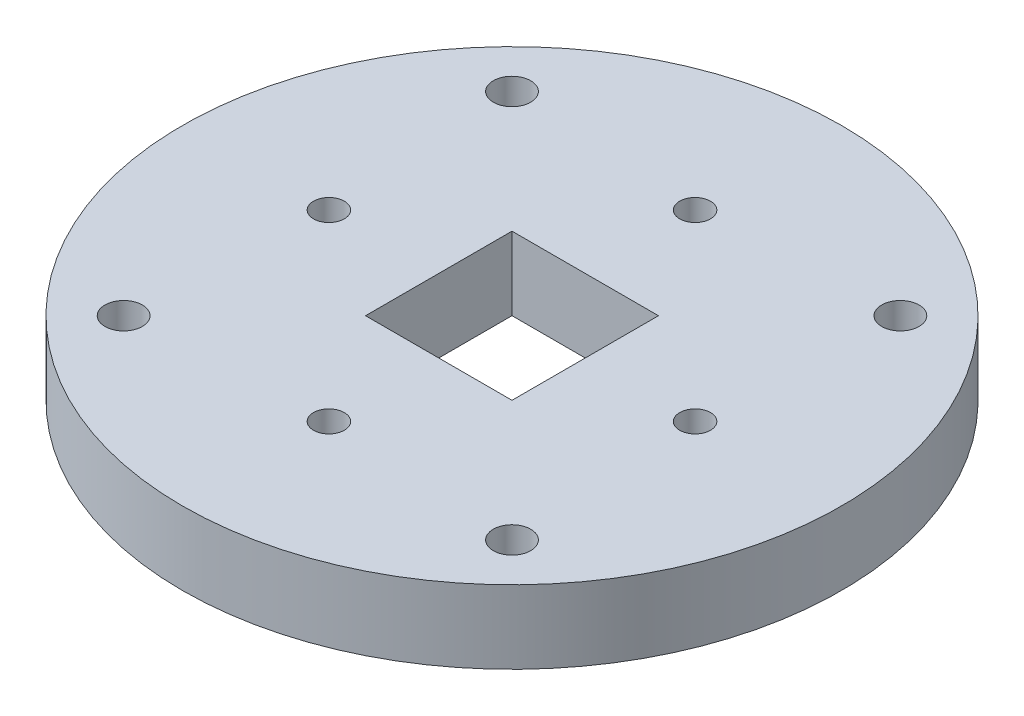
ISO-10303-21;
HEADER;
FILE_DESCRIPTION(('STEP AP214'),'2;1');
FILE_NAME('part.step','',(''),(''),'','','');
FILE_SCHEMA(('AUTOMOTIVE_DESIGN { 1 0 10303 214 1 1 1 1 }'));
ENDSEC;
DATA;
#1=APPLICATION_CONTEXT('core data for automotive mechanical design processes');
#2=APPLICATION_PROTOCOL_DEFINITION('international standard','automotive_design',2000,#1);
#3=PRODUCT_CONTEXT('',#1,'mechanical');
#4=PRODUCT('Part','Part','',(#3));
#5=PRODUCT_RELATED_PRODUCT_CATEGORY('part','',(#4));
#6=PRODUCT_DEFINITION_FORMATION('','',#4);
#7=PRODUCT_DEFINITION_CONTEXT('part definition',#1,'design');
#8=PRODUCT_DEFINITION('design','',#6,#7);
#9=PRODUCT_DEFINITION_SHAPE('','',#8);
#10=(LENGTH_UNIT() NAMED_UNIT(*) SI_UNIT(.MILLI.,.METRE.));
#11=(NAMED_UNIT(*) PLANE_ANGLE_UNIT() SI_UNIT($,.RADIAN.));
#12=(NAMED_UNIT(*) SI_UNIT($,.STERADIAN.) SOLID_ANGLE_UNIT());
#13=UNCERTAINTY_MEASURE_WITH_UNIT(LENGTH_MEASURE(1.E-05),#10,'distance_accuracy_value','');
#14=(GEOMETRIC_REPRESENTATION_CONTEXT(3) GLOBAL_UNCERTAINTY_ASSIGNED_CONTEXT((#13)) GLOBAL_UNIT_ASSIGNED_CONTEXT((#10,
#11,#12)) REPRESENTATION_CONTEXT('',''));
#15=CARTESIAN_POINT('',(0.,0.,0.));
#16=DIRECTION('',(0.,0.,1.));
#17=DIRECTION('',(1.,0.,0.));
#18=AXIS2_PLACEMENT_3D('',#15,#16,#17);
#19=CARTESIAN_POINT('',(0.,10.,0.));
#20=DIRECTION('',(0.,-1.,0.));
#21=DIRECTION('',(0.,0.,-1.));
#22=AXIS2_PLACEMENT_3D('',#19,#20,#21);
#23=CYLINDRICAL_SURFACE('',#22,45.);
#24=CARTESIAN_POINT('',(0.,10.,0.));
#25=DIRECTION('',(0.,1.,0.));
#26=DIRECTION('',(0.,0.,1.));
#27=AXIS2_PLACEMENT_3D('',#24,#25,#26);
#28=CIRCLE('',#27,45.);
#29=CARTESIAN_POINT('',(0.,10.,45.));
#30=VERTEX_POINT('',#29);
#31=EDGE_CURVE('E11',#30,#30,#28,.T.);
#32=ORIENTED_EDGE('',*,*,#31,.F.);
#33=EDGE_LOOP('',(#32));
#34=FACE_BOUND('',#33,.T.);
#35=CARTESIAN_POINT('',(0.,0.,0.));
#36=DIRECTION('',(0.,1.,0.));
#37=DIRECTION('',(0.,0.,1.));
#38=AXIS2_PLACEMENT_3D('',#35,#36,#37);
#39=CIRCLE('',#38,45.);
#40=CARTESIAN_POINT('',(0.,0.,45.));
#41=VERTEX_POINT('',#40);
#42=EDGE_CURVE('E38',#41,#41,#39,.T.);
#43=ORIENTED_EDGE('',*,*,#42,.T.);
#44=EDGE_LOOP('',(#43));
#45=FACE_BOUND('',#44,.T.);
#46=ADVANCED_FACE('F35',(#34,#45),#23,.T.);
#47=CARTESIAN_POINT('',(0.,10.,0.));
#48=DIRECTION('',(0.,1.,0.));
#49=DIRECTION('',(0.,0.,1.));
#50=AXIS2_PLACEMENT_3D('',#47,#48,#49);
#51=PLANE('',#50);
#52=CARTESIAN_POINT('',(-26.5165042944955,10.,26.5165042944956));
#53=DIRECTION('',(0.,1.,0.));
#54=DIRECTION('',(0.,0.,1.));
#55=AXIS2_PLACEMENT_3D('',#52,#53,#54);
#56=CIRCLE('',#55,2.54999999999999);
#57=CARTESIAN_POINT('',(-26.5165042944955,10.,29.0665042944956));
#58=VERTEX_POINT('',#57);
#59=EDGE_CURVE('E209',#58,#58,#56,.T.);
#60=ORIENTED_EDGE('',*,*,#59,.F.);
#61=EDGE_LOOP('',(#60));
#62=FACE_BOUND('',#61,.T.);
#63=CARTESIAN_POINT('',(26.5165042944955,10.,26.5165042944956));
#64=DIRECTION('',(0.,1.,0.));
#65=DIRECTION('',(0.,0.,1.));
#66=AXIS2_PLACEMENT_3D('',#63,#64,#65);
#67=CIRCLE('',#66,2.54999999999981);
#68=CARTESIAN_POINT('',(26.5165042944955,10.,29.0665042944954));
#69=VERTEX_POINT('',#68);
#70=EDGE_CURVE('E211',#69,#69,#67,.T.);
#71=ORIENTED_EDGE('',*,*,#70,.F.);
#72=EDGE_LOOP('',(#71));
#73=FACE_BOUND('',#72,.T.);
#74=CARTESIAN_POINT('',(26.5165042944955,10.,-26.5165042944956));
#75=DIRECTION('',(0.,1.,0.));
#76=DIRECTION('',(0.,0.,1.));
#77=AXIS2_PLACEMENT_3D('',#74,#75,#76);
#78=CIRCLE('',#77,2.55000000000002);
#79=CARTESIAN_POINT('',(26.5165042944955,10.,-23.9665042944956));
#80=VERTEX_POINT('',#79);
#81=EDGE_CURVE('E217',#80,#80,#78,.T.);
#82=ORIENTED_EDGE('',*,*,#81,.F.);
#83=EDGE_LOOP('',(#82));
#84=FACE_BOUND('',#83,.T.);
#85=CARTESIAN_POINT('',(-26.5165042944955,10.,-26.5165042944956));
#86=DIRECTION('',(0.,1.,0.));
#87=DIRECTION('',(0.,0.,1.));
#88=AXIS2_PLACEMENT_3D('',#85,#86,#87);
#89=CIRCLE('',#88,2.55);
#90=CARTESIAN_POINT('',(-26.5165042944955,10.,-23.9665042944956));
#91=VERTEX_POINT('',#90);
#92=EDGE_CURVE('E99',#91,#91,#89,.T.);
#93=ORIENTED_EDGE('',*,*,#92,.F.);
#94=EDGE_LOOP('',(#93));
#95=FACE_BOUND('',#94,.T.);
#96=DIRECTION('',(0.,0.,-1.));
#97=VECTOR('',#96,1.);
#98=CARTESIAN_POINT('',(10.,10.,10.));
#99=LINE('',#98,#97);
#100=CARTESIAN_POINT('',(10.,10.,10.));
#101=VERTEX_POINT('',#100);
#102=CARTESIAN_POINT('',(10.,10.,-10.));
#103=VERTEX_POINT('',#102);
#104=EDGE_CURVE('E49',#101,#103,#99,.T.);
#105=ORIENTED_EDGE('',*,*,#104,.F.);
#106=DIRECTION('',(1.,0.,0.));
#107=VECTOR('',#106,1.);
#108=CARTESIAN_POINT('',(-10.,10.,10.));
#109=LINE('',#108,#107);
#110=CARTESIAN_POINT('',(-10.,10.,10.));
#111=VERTEX_POINT('',#110);
#112=EDGE_CURVE('E93',#111,#101,#109,.T.);
#113=ORIENTED_EDGE('',*,*,#112,.F.);
#114=DIRECTION('',(0.,0.,1.));
#115=VECTOR('',#114,1.);
#116=CARTESIAN_POINT('',(-10.,10.,10.));
#117=LINE('',#116,#115);
#118=CARTESIAN_POINT('',(-10.,10.,-10.));
#119=VERTEX_POINT('',#118);
#120=EDGE_CURVE('E96',#119,#111,#117,.T.);
#121=ORIENTED_EDGE('',*,*,#120,.F.);
#122=DIRECTION('',(-1.,0.,0.));
#123=VECTOR('',#122,1.);
#124=CARTESIAN_POINT('',(-10.,10.,-10.));
#125=LINE('',#124,#123);
#126=EDGE_CURVE('E105',#103,#119,#125,.T.);
#127=ORIENTED_EDGE('',*,*,#126,.F.);
#128=EDGE_LOOP('',(#105,#113,#121,#127));
#129=FACE_BOUND('',#128,.T.);
#130=CARTESIAN_POINT('',(-25.,10.,-2.61861100413235E-13));
#131=DIRECTION('',(0.,1.,0.));
#132=DIRECTION('',(1.,0.,0.));
#133=AXIS2_PLACEMENT_3D('',#130,#131,#132);
#134=CIRCLE('',#133,2.1);
#135=CARTESIAN_POINT('',(-22.9,10.,-2.39864767978523E-13));
#136=VERTEX_POINT('',#135);
#137=EDGE_CURVE('E112',#136,#136,#134,.T.);
#138=ORIENTED_EDGE('',*,*,#137,.F.);
#139=EDGE_LOOP('',(#138));
#140=FACE_BOUND('',#139,.T.);
#141=CARTESIAN_POINT('',(0.,10.,25.));
#142=DIRECTION('',(0.,1.,0.));
#143=DIRECTION('',(0.,0.,-1.));
#144=AXIS2_PLACEMENT_3D('',#141,#142,#143);
#145=CIRCLE('',#144,2.1);
#146=CARTESIAN_POINT('',(0.,10.,22.9));
#147=VERTEX_POINT('',#146);
#148=EDGE_CURVE('E119',#147,#147,#145,.T.);
#149=ORIENTED_EDGE('',*,*,#148,.F.);
#150=EDGE_LOOP('',(#149));
#151=FACE_BOUND('',#150,.T.);
#152=CARTESIAN_POINT('',(25.,10.,0.));
#153=DIRECTION('',(0.,1.,0.));
#154=DIRECTION('',(-1.,0.,0.));
#155=AXIS2_PLACEMENT_3D('',#152,#153,#154);
#156=CIRCLE('',#155,2.1);
#157=CARTESIAN_POINT('',(22.9,10.,0.));
#158=VERTEX_POINT('',#157);
#159=EDGE_CURVE('E125',#158,#158,#156,.T.);
#160=ORIENTED_EDGE('',*,*,#159,.F.);
#161=EDGE_LOOP('',(#160));
#162=FACE_BOUND('',#161,.T.);
#163=CARTESIAN_POINT('',(0.,10.,-25.));
#164=DIRECTION('',(0.,1.,0.));
#165=DIRECTION('',(0.,0.,1.));
#166=AXIS2_PLACEMENT_3D('',#163,#164,#165);
#167=CIRCLE('',#166,2.1);
#168=CARTESIAN_POINT('',(0.,10.,-22.9));
#169=VERTEX_POINT('',#168);
#170=EDGE_CURVE('E131',#169,#169,#167,.T.);
#171=ORIENTED_EDGE('',*,*,#170,.F.);
#172=EDGE_LOOP('',(#171));
#173=FACE_BOUND('',#172,.T.);
#174=ORIENTED_EDGE('',*,*,#31,.T.);
#175=EDGE_LOOP('',(#174));
#176=FACE_BOUND('',#175,.T.);
#177=ADVANCED_FACE('F142',(#62,#73,#84,#95,#129,#140,#151,#162,#173,#176),#51,.T.);
#178=CARTESIAN_POINT('',(0.,0.,0.));
#179=DIRECTION('',(0.,1.,0.));
#180=DIRECTION('',(0.,0.,1.));
#181=AXIS2_PLACEMENT_3D('',#178,#179,#180);
#182=PLANE('',#181);
#183=CARTESIAN_POINT('',(-26.5165042944955,0.,26.5165042944956));
#184=DIRECTION('',(0.,1.,0.));
#185=DIRECTION('',(0.,0.,1.));
#186=AXIS2_PLACEMENT_3D('',#183,#184,#185);
#187=CIRCLE('',#186,2.54999999999999);
#188=CARTESIAN_POINT('',(-26.5165042944955,0.,29.0665042944956));
#189=VERTEX_POINT('',#188);
#190=EDGE_CURVE('E206',#189,#189,#187,.T.);
#191=ORIENTED_EDGE('',*,*,#190,.T.);
#192=EDGE_LOOP('',(#191));
#193=FACE_BOUND('',#192,.T.);
#194=CARTESIAN_POINT('',(26.5165042944955,0.,26.5165042944956));
#195=DIRECTION('',(0.,1.,0.));
#196=DIRECTION('',(0.,0.,1.));
#197=AXIS2_PLACEMENT_3D('',#194,#195,#196);
#198=CIRCLE('',#197,2.54999999999981);
#199=CARTESIAN_POINT('',(26.5165042944955,0.,29.0665042944954));
#200=VERTEX_POINT('',#199);
#201=EDGE_CURVE('E214',#200,#200,#198,.T.);
#202=ORIENTED_EDGE('',*,*,#201,.T.);
#203=EDGE_LOOP('',(#202));
#204=FACE_BOUND('',#203,.T.);
#205=CARTESIAN_POINT('',(26.5165042944955,0.,-26.5165042944956));
#206=DIRECTION('',(0.,1.,0.));
#207=DIRECTION('',(0.,0.,1.));
#208=AXIS2_PLACEMENT_3D('',#205,#206,#207);
#209=CIRCLE('',#208,2.55000000000002);
#210=CARTESIAN_POINT('',(26.5165042944955,0.,-23.9665042944956));
#211=VERTEX_POINT('',#210);
#212=EDGE_CURVE('E220',#211,#211,#209,.T.);
#213=ORIENTED_EDGE('',*,*,#212,.T.);
#214=EDGE_LOOP('',(#213));
#215=FACE_BOUND('',#214,.T.);
#216=CARTESIAN_POINT('',(-26.5165042944955,0.,-26.5165042944956));
#217=DIRECTION('',(0.,1.,0.));
#218=DIRECTION('',(0.,0.,1.));
#219=AXIS2_PLACEMENT_3D('',#216,#217,#218);
#220=CIRCLE('',#219,2.55);
#221=CARTESIAN_POINT('',(-26.5165042944955,0.,-23.9665042944956));
#222=VERTEX_POINT('',#221);
#223=EDGE_CURVE('E106',#222,#222,#220,.T.);
#224=ORIENTED_EDGE('',*,*,#223,.T.);
#225=EDGE_LOOP('',(#224));
#226=FACE_BOUND('',#225,.T.);
#227=DIRECTION('',(1.,0.,0.));
#228=VECTOR('',#227,1.);
#229=CARTESIAN_POINT('',(-10.,0.,10.));
#230=LINE('',#229,#228);
#231=CARTESIAN_POINT('',(-10.,0.,10.));
#232=VERTEX_POINT('',#231);
#233=CARTESIAN_POINT('',(10.,0.,10.));
#234=VERTEX_POINT('',#233);
#235=EDGE_CURVE('E83',#232,#234,#230,.T.);
#236=ORIENTED_EDGE('',*,*,#235,.T.);
#237=DIRECTION('',(0.,0.,-1.));
#238=VECTOR('',#237,1.);
#239=CARTESIAN_POINT('',(10.,0.,10.));
#240=LINE('',#239,#238);
#241=CARTESIAN_POINT('',(10.,0.,-10.));
#242=VERTEX_POINT('',#241);
#243=EDGE_CURVE('E77',#234,#242,#240,.T.);
#244=ORIENTED_EDGE('',*,*,#243,.T.);
#245=DIRECTION('',(-1.,0.,0.));
#246=VECTOR('',#245,1.);
#247=CARTESIAN_POINT('',(-10.,0.,-10.));
#248=LINE('',#247,#246);
#249=CARTESIAN_POINT('',(-10.,0.,-10.));
#250=VERTEX_POINT('',#249);
#251=EDGE_CURVE('E86',#242,#250,#248,.T.);
#252=ORIENTED_EDGE('',*,*,#251,.T.);
#253=DIRECTION('',(0.,0.,1.));
#254=VECTOR('',#253,1.);
#255=CARTESIAN_POINT('',(-10.,0.,10.));
#256=LINE('',#255,#254);
#257=EDGE_CURVE('E57',#250,#232,#256,.T.);
#258=ORIENTED_EDGE('',*,*,#257,.T.);
#259=EDGE_LOOP('',(#236,#244,#252,#258));
#260=FACE_BOUND('',#259,.T.);
#261=CARTESIAN_POINT('',(-25.,0.,-2.61861100413235E-13));
#262=DIRECTION('',(0.,1.,0.));
#263=DIRECTION('',(1.,0.,0.));
#264=AXIS2_PLACEMENT_3D('',#261,#262,#263);
#265=CIRCLE('',#264,2.1);
#266=CARTESIAN_POINT('',(-22.9,0.,-2.39864767978523E-13));
#267=VERTEX_POINT('',#266);
#268=EDGE_CURVE('E116',#267,#267,#265,.T.);
#269=ORIENTED_EDGE('',*,*,#268,.T.);
#270=EDGE_LOOP('',(#269));
#271=FACE_BOUND('',#270,.T.);
#272=CARTESIAN_POINT('',(0.,0.,25.));
#273=DIRECTION('',(0.,1.,0.));
#274=DIRECTION('',(0.,0.,-1.));
#275=AXIS2_PLACEMENT_3D('',#272,#273,#274);
#276=CIRCLE('',#275,2.1);
#277=CARTESIAN_POINT('',(0.,0.,22.9));
#278=VERTEX_POINT('',#277);
#279=EDGE_CURVE('E122',#278,#278,#276,.T.);
#280=ORIENTED_EDGE('',*,*,#279,.T.);
#281=EDGE_LOOP('',(#280));
#282=FACE_BOUND('',#281,.T.);
#283=CARTESIAN_POINT('',(25.,0.,0.));
#284=DIRECTION('',(0.,1.,0.));
#285=DIRECTION('',(-1.,0.,0.));
#286=AXIS2_PLACEMENT_3D('',#283,#284,#285);
#287=CIRCLE('',#286,2.1);
#288=CARTESIAN_POINT('',(22.9,0.,0.));
#289=VERTEX_POINT('',#288);
#290=EDGE_CURVE('E128',#289,#289,#287,.T.);
#291=ORIENTED_EDGE('',*,*,#290,.T.);
#292=EDGE_LOOP('',(#291));
#293=FACE_BOUND('',#292,.T.);
#294=CARTESIAN_POINT('',(0.,0.,-25.));
#295=DIRECTION('',(0.,1.,0.));
#296=DIRECTION('',(0.,0.,1.));
#297=AXIS2_PLACEMENT_3D('',#294,#295,#296);
#298=CIRCLE('',#297,2.1);
#299=CARTESIAN_POINT('',(0.,0.,-22.9));
#300=VERTEX_POINT('',#299);
#301=EDGE_CURVE('E134',#300,#300,#298,.T.);
#302=ORIENTED_EDGE('',*,*,#301,.T.);
#303=EDGE_LOOP('',(#302));
#304=FACE_BOUND('',#303,.T.);
#305=ORIENTED_EDGE('',*,*,#42,.F.);
#306=EDGE_LOOP('',(#305));
#307=FACE_BOUND('',#306,.T.);
#308=ADVANCED_FACE('F90',(#193,#204,#215,#226,#260,#271,#282,#293,#304,#307),#182,.F.);
#309=CARTESIAN_POINT('',(0.,0.,-25.));
#310=DIRECTION('',(0.,1.,0.));
#311=DIRECTION('',(0.,0.,1.));
#312=AXIS2_PLACEMENT_3D('',#309,#310,#311);
#313=CYLINDRICAL_SURFACE('',#312,2.1);
#314=ORIENTED_EDGE('',*,*,#301,.F.);
#315=EDGE_LOOP('',(#314));
#316=FACE_BOUND('',#315,.T.);
#317=ORIENTED_EDGE('',*,*,#170,.T.);
#318=EDGE_LOOP('',(#317));
#319=FACE_BOUND('',#318,.T.);
#320=ADVANCED_FACE('F140',(#316,#319),#313,.F.);
#321=CARTESIAN_POINT('',(25.,0.,0.));
#322=DIRECTION('',(0.,1.,0.));
#323=DIRECTION('',(0.,0.,1.));
#324=AXIS2_PLACEMENT_3D('',#321,#322,#323);
#325=CYLINDRICAL_SURFACE('',#324,2.1);
#326=ORIENTED_EDGE('',*,*,#290,.F.);
#327=EDGE_LOOP('',(#326));
#328=FACE_BOUND('',#327,.T.);
#329=ORIENTED_EDGE('',*,*,#159,.T.);
#330=EDGE_LOOP('',(#329));
#331=FACE_BOUND('',#330,.T.);
#332=ADVANCED_FACE('F159',(#328,#331),#325,.F.);
#333=CARTESIAN_POINT('',(0.,0.,25.));
#334=DIRECTION('',(0.,1.,0.));
#335=DIRECTION('',(0.,0.,1.));
#336=AXIS2_PLACEMENT_3D('',#333,#334,#335);
#337=CYLINDRICAL_SURFACE('',#336,2.1);
#338=ORIENTED_EDGE('',*,*,#279,.F.);
#339=EDGE_LOOP('',(#338));
#340=FACE_BOUND('',#339,.T.);
#341=ORIENTED_EDGE('',*,*,#148,.T.);
#342=EDGE_LOOP('',(#341));
#343=FACE_BOUND('',#342,.T.);
#344=ADVANCED_FACE('F167',(#340,#343),#337,.F.);
#345=CARTESIAN_POINT('',(-25.,0.,-2.61861100413235E-13));
#346=DIRECTION('',(0.,1.,0.));
#347=DIRECTION('',(0.,0.,1.));
#348=AXIS2_PLACEMENT_3D('',#345,#346,#347);
#349=CYLINDRICAL_SURFACE('',#348,2.1);
#350=ORIENTED_EDGE('',*,*,#268,.F.);
#351=EDGE_LOOP('',(#350));
#352=FACE_BOUND('',#351,.T.);
#353=ORIENTED_EDGE('',*,*,#137,.T.);
#354=EDGE_LOOP('',(#353));
#355=FACE_BOUND('',#354,.T.);
#356=ADVANCED_FACE('F171',(#352,#355),#349,.F.);
#357=CARTESIAN_POINT('',(10.,0.,10.));
#358=DIRECTION('',(1.,0.,0.));
#359=DIRECTION('',(0.,0.,-1.));
#360=AXIS2_PLACEMENT_3D('',#357,#358,#359);
#361=PLANE('',#360);
#362=ORIENTED_EDGE('',*,*,#104,.T.);
#363=DIRECTION('',(0.,1.,0.));
#364=VECTOR('',#363,1.);
#365=CARTESIAN_POINT('',(10.,0.,-10.));
#366=LINE('',#365,#364);
#367=EDGE_CURVE('E73',#242,#103,#366,.T.);
#368=ORIENTED_EDGE('',*,*,#367,.F.);
#369=ORIENTED_EDGE('',*,*,#243,.F.);
#370=DIRECTION('',(0.,1.,0.));
#371=VECTOR('',#370,1.);
#372=CARTESIAN_POINT('',(10.,0.,10.));
#373=LINE('',#372,#371);
#374=EDGE_CURVE('E110',#234,#101,#373,.T.);
#375=ORIENTED_EDGE('',*,*,#374,.T.);
#376=EDGE_LOOP('',(#362,#368,#369,#375));
#377=FACE_BOUND('',#376,.T.);
#378=ADVANCED_FACE('F75',(#377),#361,.F.);
#379=CARTESIAN_POINT('',(-10.,0.,10.));
#380=DIRECTION('',(0.,0.,1.));
#381=DIRECTION('',(1.,0.,0.));
#382=AXIS2_PLACEMENT_3D('',#379,#380,#381);
#383=PLANE('',#382);
#384=ORIENTED_EDGE('',*,*,#112,.T.);
#385=ORIENTED_EDGE('',*,*,#374,.F.);
#386=ORIENTED_EDGE('',*,*,#235,.F.);
#387=DIRECTION('',(0.,1.,0.));
#388=VECTOR('',#387,1.);
#389=CARTESIAN_POINT('',(-10.,0.,10.));
#390=LINE('',#389,#388);
#391=EDGE_CURVE('E113',#232,#111,#390,.T.);
#392=ORIENTED_EDGE('',*,*,#391,.T.);
#393=EDGE_LOOP('',(#384,#385,#386,#392));
#394=FACE_BOUND('',#393,.T.);
#395=ADVANCED_FACE('F178',(#394),#383,.F.);
#396=CARTESIAN_POINT('',(-10.,0.,10.));
#397=DIRECTION('',(-1.,0.,0.));
#398=DIRECTION('',(0.,0.,1.));
#399=AXIS2_PLACEMENT_3D('',#396,#397,#398);
#400=PLANE('',#399);
#401=ORIENTED_EDGE('',*,*,#120,.T.);
#402=ORIENTED_EDGE('',*,*,#391,.F.);
#403=ORIENTED_EDGE('',*,*,#257,.F.);
#404=DIRECTION('',(0.,1.,0.));
#405=VECTOR('',#404,1.);
#406=CARTESIAN_POINT('',(-10.,0.,-10.));
#407=LINE('',#406,#405);
#408=EDGE_CURVE('E82',#250,#119,#407,.T.);
#409=ORIENTED_EDGE('',*,*,#408,.T.);
#410=EDGE_LOOP('',(#401,#402,#403,#409));
#411=FACE_BOUND('',#410,.T.);
#412=ADVANCED_FACE('F182',(#411),#400,.F.);
#413=CARTESIAN_POINT('',(-10.,0.,-10.));
#414=DIRECTION('',(0.,0.,-1.));
#415=DIRECTION('',(-1.,0.,0.));
#416=AXIS2_PLACEMENT_3D('',#413,#414,#415);
#417=PLANE('',#416);
#418=ORIENTED_EDGE('',*,*,#126,.T.);
#419=ORIENTED_EDGE('',*,*,#408,.F.);
#420=ORIENTED_EDGE('',*,*,#251,.F.);
#421=ORIENTED_EDGE('',*,*,#367,.T.);
#422=EDGE_LOOP('',(#418,#419,#420,#421));
#423=FACE_BOUND('',#422,.T.);
#424=ADVANCED_FACE('F87',(#423),#417,.F.);
#425=CARTESIAN_POINT('',(-26.5165042944955,0.,-26.5165042944956));
#426=DIRECTION('',(0.,1.,0.));
#427=DIRECTION('',(0.,0.,1.));
#428=AXIS2_PLACEMENT_3D('',#425,#426,#427);
#429=CYLINDRICAL_SURFACE('',#428,2.55);
#430=ORIENTED_EDGE('',*,*,#223,.F.);
#431=EDGE_LOOP('',(#430));
#432=FACE_BOUND('',#431,.T.);
#433=ORIENTED_EDGE('',*,*,#92,.T.);
#434=EDGE_LOOP('',(#433));
#435=FACE_BOUND('',#434,.T.);
#436=ADVANCED_FACE('F181',(#432,#435),#429,.F.);
#437=CARTESIAN_POINT('',(26.5165042944955,0.,-26.5165042944956));
#438=DIRECTION('',(0.,1.,0.));
#439=DIRECTION('',(0.,0.,1.));
#440=AXIS2_PLACEMENT_3D('',#437,#438,#439);
#441=CYLINDRICAL_SURFACE('',#440,2.55000000000002);
#442=ORIENTED_EDGE('',*,*,#212,.F.);
#443=EDGE_LOOP('',(#442));
#444=FACE_BOUND('',#443,.T.);
#445=ORIENTED_EDGE('',*,*,#81,.T.);
#446=EDGE_LOOP('',(#445));
#447=FACE_BOUND('',#446,.T.);
#448=ADVANCED_FACE('F190',(#444,#447),#441,.F.);
#449=CARTESIAN_POINT('',(26.5165042944955,0.,26.5165042944956));
#450=DIRECTION('',(0.,1.,0.));
#451=DIRECTION('',(0.,0.,1.));
#452=AXIS2_PLACEMENT_3D('',#449,#450,#451);
#453=CYLINDRICAL_SURFACE('',#452,2.54999999999981);
#454=ORIENTED_EDGE('',*,*,#201,.F.);
#455=EDGE_LOOP('',(#454));
#456=FACE_BOUND('',#455,.T.);
#457=ORIENTED_EDGE('',*,*,#70,.T.);
#458=EDGE_LOOP('',(#457));
#459=FACE_BOUND('',#458,.T.);
#460=ADVANCED_FACE('F194',(#456,#459),#453,.F.);
#461=CARTESIAN_POINT('',(-26.5165042944955,0.,26.5165042944956));
#462=DIRECTION('',(0.,1.,0.));
#463=DIRECTION('',(0.,0.,1.));
#464=AXIS2_PLACEMENT_3D('',#461,#462,#463);
#465=CYLINDRICAL_SURFACE('',#464,2.54999999999999);
#466=ORIENTED_EDGE('',*,*,#190,.F.);
#467=EDGE_LOOP('',(#466));
#468=FACE_BOUND('',#467,.T.);
#469=ORIENTED_EDGE('',*,*,#59,.T.);
#470=EDGE_LOOP('',(#469));
#471=FACE_BOUND('',#470,.T.);
#472=ADVANCED_FACE('F198',(#468,#471),#465,.F.);
#473=CLOSED_SHELL('',(#46,#177,#308,#320,#332,#344,#356,#378,#395,#412,#424,#436,#448,#460,#472));
#474=MANIFOLD_SOLID_BREP('B2',#473);
#475=ADVANCED_BREP_SHAPE_REPRESENTATION('',(#18,#474),#14);
#476=SHAPE_DEFINITION_REPRESENTATION(#9,#475);
ENDSEC;
END-ISO-10303-21;
